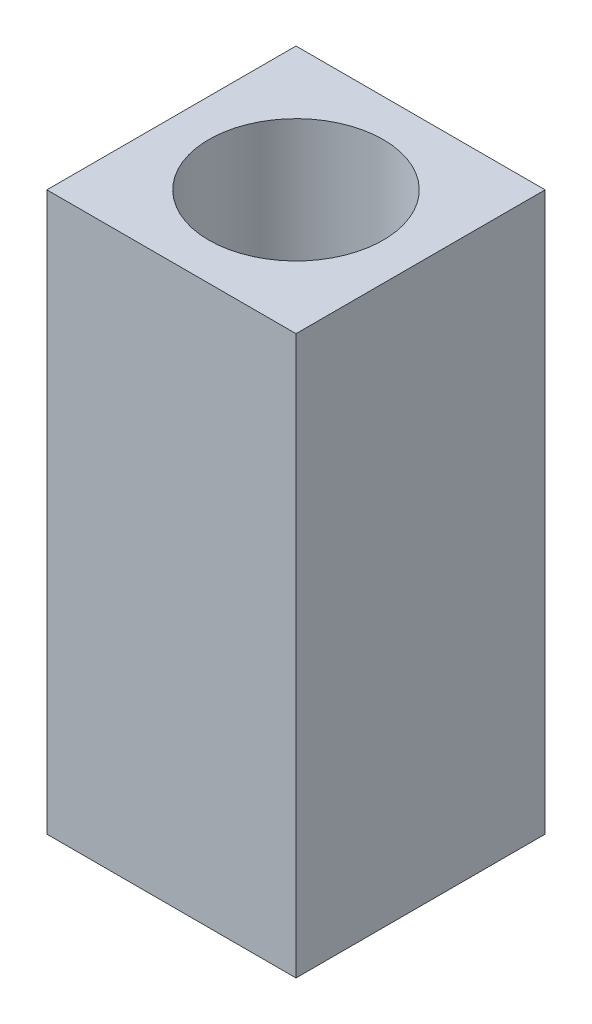
ISO-10303-21;
HEADER;
FILE_DESCRIPTION(('STEP AP214'),'2;1');
FILE_NAME('part.step','',(''),(''),'','','');
FILE_SCHEMA(('AUTOMOTIVE_DESIGN { 1 0 10303 214 1 1 1 1 }'));
ENDSEC;
DATA;
#1=APPLICATION_CONTEXT('core data for automotive mechanical design processes');
#2=APPLICATION_PROTOCOL_DEFINITION('international standard','automotive_design',2000,#1);
#3=PRODUCT_CONTEXT('',#1,'mechanical');
#4=PRODUCT('Part','Part','',(#3));
#5=PRODUCT_RELATED_PRODUCT_CATEGORY('part','',(#4));
#6=PRODUCT_DEFINITION_FORMATION('','',#4);
#7=PRODUCT_DEFINITION_CONTEXT('part definition',#1,'design');
#8=PRODUCT_DEFINITION('design','',#6,#7);
#9=PRODUCT_DEFINITION_SHAPE('','',#8);
#10=(LENGTH_UNIT() NAMED_UNIT(*) SI_UNIT(.MILLI.,.METRE.));
#11=(NAMED_UNIT(*) PLANE_ANGLE_UNIT() SI_UNIT($,.RADIAN.));
#12=(NAMED_UNIT(*) SI_UNIT($,.STERADIAN.) SOLID_ANGLE_UNIT());
#13=UNCERTAINTY_MEASURE_WITH_UNIT(LENGTH_MEASURE(1.E-05),#10,'distance_accuracy_value','');
#14=(GEOMETRIC_REPRESENTATION_CONTEXT(3) GLOBAL_UNCERTAINTY_ASSIGNED_CONTEXT((#13)) GLOBAL_UNIT_ASSIGNED_CONTEXT((#10,
#11,#12)) REPRESENTATION_CONTEXT('',''));
#15=CARTESIAN_POINT('',(0.,0.,0.));
#16=DIRECTION('',(0.,0.,1.));
#17=DIRECTION('',(1.,0.,0.));
#18=AXIS2_PLACEMENT_3D('',#15,#16,#17);
#19=CARTESIAN_POINT('',(0.,11.2,0.));
#20=DIRECTION('',(0.,-1.,0.));
#21=DIRECTION('',(0.,0.,-1.));
#22=AXIS2_PLACEMENT_3D('',#19,#20,#21);
#23=PLANE('',#22);
#24=DIRECTION('',(0.,0.,-1.));
#25=VECTOR('',#24,1.);
#26=CARTESIAN_POINT('',(2.5,11.2,2.5));
#27=LINE('',#26,#25);
#28=CARTESIAN_POINT('',(2.5,11.2,2.5));
#29=VERTEX_POINT('',#28);
#30=CARTESIAN_POINT('',(2.5,11.2,-2.5));
#31=VERTEX_POINT('',#30);
#32=EDGE_CURVE('E92',#29,#31,#27,.T.);
#33=ORIENTED_EDGE('',*,*,#32,.T.);
#34=DIRECTION('',(-1.,0.,0.));
#35=VECTOR('',#34,1.);
#36=CARTESIAN_POINT('',(-2.5,11.2,-2.5));
#37=LINE('',#36,#35);
#38=CARTESIAN_POINT('',(-2.5,11.2,-2.5));
#39=VERTEX_POINT('',#38);
#40=EDGE_CURVE('E87',#31,#39,#37,.T.);
#41=ORIENTED_EDGE('',*,*,#40,.T.);
#42=DIRECTION('',(0.,0.,1.));
#43=VECTOR('',#42,1.);
#44=CARTESIAN_POINT('',(-2.5,11.2,2.5));
#45=LINE('',#44,#43);
#46=CARTESIAN_POINT('',(-2.5,11.2,2.5));
#47=VERTEX_POINT('',#46);
#48=EDGE_CURVE('E90',#39,#47,#45,.T.);
#49=ORIENTED_EDGE('',*,*,#48,.T.);
#50=DIRECTION('',(1.,0.,0.));
#51=VECTOR('',#50,1.);
#52=CARTESIAN_POINT('',(-2.5,11.2,2.5));
#53=LINE('',#52,#51);
#54=EDGE_CURVE('E57',#47,#29,#53,.T.);
#55=ORIENTED_EDGE('',*,*,#54,.T.);
#56=EDGE_LOOP('',(#33,#41,#49,#55));
#57=FACE_BOUND('',#56,.T.);
#58=CARTESIAN_POINT('',(0.,11.2,0.));
#59=DIRECTION('',(0.,1.,0.));
#60=DIRECTION('',(0.,0.,1.));
#61=AXIS2_PLACEMENT_3D('',#58,#59,#60);
#62=CIRCLE('',#61,1.75);
#63=CARTESIAN_POINT('',(0.,11.2,1.75));
#64=VERTEX_POINT('',#63);
#65=EDGE_CURVE('E112',#64,#64,#62,.T.);
#66=ORIENTED_EDGE('',*,*,#65,.F.);
#67=EDGE_LOOP('',(#66));
#68=FACE_BOUND('',#67,.T.);
#69=ADVANCED_FACE('F39',(#57,#68),#23,.F.);
#70=CARTESIAN_POINT('',(0.,0.,0.));
#71=DIRECTION('',(0.,-1.,0.));
#72=DIRECTION('',(0.,0.,-1.));
#73=AXIS2_PLACEMENT_3D('',#70,#71,#72);
#74=PLANE('',#73);
#75=DIRECTION('',(0.,0.,-1.));
#76=VECTOR('',#75,1.);
#77=CARTESIAN_POINT('',(2.5,0.,2.5));
#78=LINE('',#77,#76);
#79=CARTESIAN_POINT('',(2.5,0.,2.5));
#80=VERTEX_POINT('',#79);
#81=CARTESIAN_POINT('',(2.5,0.,-2.5));
#82=VERTEX_POINT('',#81);
#83=EDGE_CURVE('E108',#80,#82,#78,.T.);
#84=ORIENTED_EDGE('',*,*,#83,.F.);
#85=DIRECTION('',(1.,0.,0.));
#86=VECTOR('',#85,1.);
#87=CARTESIAN_POINT('',(-2.5,0.,2.5));
#88=LINE('',#87,#86);
#89=CARTESIAN_POINT('',(-2.5,0.,2.5));
#90=VERTEX_POINT('',#89);
#91=EDGE_CURVE('E80',#90,#80,#88,.T.);
#92=ORIENTED_EDGE('',*,*,#91,.F.);
#93=DIRECTION('',(0.,0.,1.));
#94=VECTOR('',#93,1.);
#95=CARTESIAN_POINT('',(-2.5,0.,2.5));
#96=LINE('',#95,#94);
#97=CARTESIAN_POINT('',(-2.5,0.,-2.5));
#98=VERTEX_POINT('',#97);
#99=EDGE_CURVE('E74',#98,#90,#96,.T.);
#100=ORIENTED_EDGE('',*,*,#99,.F.);
#101=DIRECTION('',(-1.,0.,0.));
#102=VECTOR('',#101,1.);
#103=CARTESIAN_POINT('',(-2.5,0.,-2.5));
#104=LINE('',#103,#102);
#105=EDGE_CURVE('E97',#82,#98,#104,.T.);
#106=ORIENTED_EDGE('',*,*,#105,.F.);
#107=EDGE_LOOP('',(#84,#92,#100,#106));
#108=FACE_BOUND('',#107,.T.);
#109=CARTESIAN_POINT('',(0.,0.,0.));
#110=DIRECTION('',(0.,1.,0.));
#111=DIRECTION('',(0.,0.,1.));
#112=AXIS2_PLACEMENT_3D('',#109,#110,#111);
#113=CIRCLE('',#112,1.75);
#114=CARTESIAN_POINT('',(0.,0.,1.75));
#115=VERTEX_POINT('',#114);
#116=EDGE_CURVE('E130',#115,#115,#113,.T.);
#117=ORIENTED_EDGE('',*,*,#116,.T.);
#118=EDGE_LOOP('',(#117));
#119=FACE_BOUND('',#118,.T.);
#120=ADVANCED_FACE('F125',(#108,#119),#74,.T.);
#121=CARTESIAN_POINT('',(2.5,11.2,2.5));
#122=DIRECTION('',(-1.,0.,0.));
#123=DIRECTION('',(0.,0.,1.));
#124=AXIS2_PLACEMENT_3D('',#121,#122,#123);
#125=PLANE('',#124);
#126=ORIENTED_EDGE('',*,*,#83,.T.);
#127=DIRECTION('',(0.,-1.,0.));
#128=VECTOR('',#127,1.);
#129=CARTESIAN_POINT('',(2.5,11.2,-2.5));
#130=LINE('',#129,#128);
#131=EDGE_CURVE('E11',#31,#82,#130,.T.);
#132=ORIENTED_EDGE('',*,*,#131,.F.);
#133=ORIENTED_EDGE('',*,*,#32,.F.);
#134=DIRECTION('',(0.,-1.,0.));
#135=VECTOR('',#134,1.);
#136=CARTESIAN_POINT('',(2.5,11.2,2.5));
#137=LINE('',#136,#135);
#138=EDGE_CURVE('E104',#29,#80,#137,.T.);
#139=ORIENTED_EDGE('',*,*,#138,.T.);
#140=EDGE_LOOP('',(#126,#132,#133,#139));
#141=FACE_BOUND('',#140,.T.);
#142=ADVANCED_FACE('F41',(#141),#125,.F.);
#143=CARTESIAN_POINT('',(-2.5,11.2,-2.5));
#144=DIRECTION('',(0.,0.,1.));
#145=DIRECTION('',(1.,0.,0.));
#146=AXIS2_PLACEMENT_3D('',#143,#144,#145);
#147=PLANE('',#146);
#148=ORIENTED_EDGE('',*,*,#105,.T.);
#149=DIRECTION('',(0.,-1.,0.));
#150=VECTOR('',#149,1.);
#151=CARTESIAN_POINT('',(-2.5,11.2,-2.5));
#152=LINE('',#151,#150);
#153=EDGE_CURVE('E49',#39,#98,#152,.T.);
#154=ORIENTED_EDGE('',*,*,#153,.F.);
#155=ORIENTED_EDGE('',*,*,#40,.F.);
#156=ORIENTED_EDGE('',*,*,#131,.T.);
#157=EDGE_LOOP('',(#148,#154,#155,#156));
#158=FACE_BOUND('',#157,.T.);
#159=ADVANCED_FACE('F96',(#158),#147,.F.);
#160=CARTESIAN_POINT('',(-2.5,11.2,2.5));
#161=DIRECTION('',(1.,0.,0.));
#162=DIRECTION('',(0.,0.,-1.));
#163=AXIS2_PLACEMENT_3D('',#160,#161,#162);
#164=PLANE('',#163);
#165=ORIENTED_EDGE('',*,*,#99,.T.);
#166=DIRECTION('',(0.,-1.,0.));
#167=VECTOR('',#166,1.);
#168=CARTESIAN_POINT('',(-2.5,11.2,2.5));
#169=LINE('',#168,#167);
#170=EDGE_CURVE('E99',#47,#90,#169,.T.);
#171=ORIENTED_EDGE('',*,*,#170,.F.);
#172=ORIENTED_EDGE('',*,*,#48,.F.);
#173=ORIENTED_EDGE('',*,*,#153,.T.);
#174=EDGE_LOOP('',(#165,#171,#172,#173));
#175=FACE_BOUND('',#174,.T.);
#176=ADVANCED_FACE('F100',(#175),#164,.F.);
#177=CARTESIAN_POINT('',(-2.5,11.2,2.5));
#178=DIRECTION('',(0.,0.,-1.));
#179=DIRECTION('',(-1.,0.,0.));
#180=AXIS2_PLACEMENT_3D('',#177,#178,#179);
#181=PLANE('',#180);
#182=ORIENTED_EDGE('',*,*,#91,.T.);
#183=ORIENTED_EDGE('',*,*,#138,.F.);
#184=ORIENTED_EDGE('',*,*,#54,.F.);
#185=ORIENTED_EDGE('',*,*,#170,.T.);
#186=EDGE_LOOP('',(#182,#183,#184,#185));
#187=FACE_BOUND('',#186,.T.);
#188=ADVANCED_FACE('F122',(#187),#181,.F.);
#189=CARTESIAN_POINT('',(0.,11.2,0.));
#190=DIRECTION('',(0.,-1.,0.));
#191=DIRECTION('',(0.,0.,-1.));
#192=AXIS2_PLACEMENT_3D('',#189,#190,#191);
#193=CYLINDRICAL_SURFACE('',#192,1.75);
#194=ORIENTED_EDGE('',*,*,#65,.T.);
#195=EDGE_LOOP('',(#194));
#196=FACE_BOUND('',#195,.T.);
#197=ORIENTED_EDGE('',*,*,#116,.F.);
#198=EDGE_LOOP('',(#197));
#199=FACE_BOUND('',#198,.T.);
#200=ADVANCED_FACE('F138',(#196,#199),#193,.F.);
#201=CLOSED_SHELL('',(#69,#120,#142,#159,#176,#188,#200));
#202=MANIFOLD_SOLID_BREP('B2',#201);
#203=ADVANCED_BREP_SHAPE_REPRESENTATION('',(#18,#202),#14);
#204=SHAPE_DEFINITION_REPRESENTATION(#9,#203);
ENDSEC;
END-ISO-10303-21;
